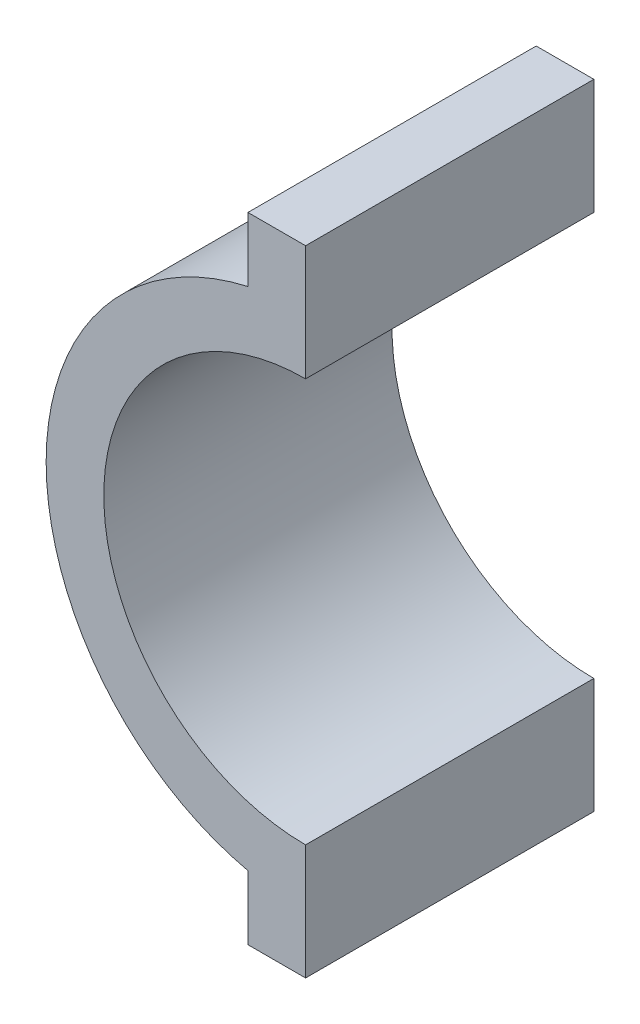
ISO-10303-21;
HEADER;
FILE_DESCRIPTION(('STEP AP214'),'2;1');
FILE_NAME('part.step','',(''),(''),'','','');
FILE_SCHEMA(('AUTOMOTIVE_DESIGN { 1 0 10303 214 1 1 1 1 }'));
ENDSEC;
DATA;
#1=APPLICATION_CONTEXT('core data for automotive mechanical design processes');
#2=APPLICATION_PROTOCOL_DEFINITION('international standard','automotive_design',2000,#1);
#3=PRODUCT_CONTEXT('',#1,'mechanical');
#4=PRODUCT('Part','Part','',(#3));
#5=PRODUCT_RELATED_PRODUCT_CATEGORY('part','',(#4));
#6=PRODUCT_DEFINITION_FORMATION('','',#4);
#7=PRODUCT_DEFINITION_CONTEXT('part definition',#1,'design');
#8=PRODUCT_DEFINITION('design','',#6,#7);
#9=PRODUCT_DEFINITION_SHAPE('','',#8);
#10=(LENGTH_UNIT() NAMED_UNIT(*) SI_UNIT(.MILLI.,.METRE.));
#11=(NAMED_UNIT(*) PLANE_ANGLE_UNIT() SI_UNIT($,.RADIAN.));
#12=(NAMED_UNIT(*) SI_UNIT($,.STERADIAN.) SOLID_ANGLE_UNIT());
#13=UNCERTAINTY_MEASURE_WITH_UNIT(LENGTH_MEASURE(1.E-05),#10,'distance_accuracy_value','');
#14=(GEOMETRIC_REPRESENTATION_CONTEXT(3) GLOBAL_UNCERTAINTY_ASSIGNED_CONTEXT((#13)) GLOBAL_UNIT_ASSIGNED_CONTEXT((#10,
#11,#12)) REPRESENTATION_CONTEXT('',''));
#15=CARTESIAN_POINT('',(0.,0.,0.));
#16=DIRECTION('',(0.,0.,1.));
#17=DIRECTION('',(1.,0.,0.));
#18=AXIS2_PLACEMENT_3D('',#15,#16,#17);
#19=CARTESIAN_POINT('',(0.,0.,25.));
#20=DIRECTION('',(0.,0.,-1.));
#21=DIRECTION('',(-1.,0.,0.));
#22=AXIS2_PLACEMENT_3D('',#19,#20,#21);
#23=CYLINDRICAL_SURFACE('',#22,22.5);
#24=CARTESIAN_POINT('',(0.,0.,0.));
#25=DIRECTION('',(0.,0.,1.));
#26=DIRECTION('',(1.,0.,0.));
#27=AXIS2_PLACEMENT_3D('',#24,#25,#26);
#28=CIRCLE('',#27,22.5);
#29=CARTESIAN_POINT('',(-5.,21.9374109684803,0.));
#30=VERTEX_POINT('',#29);
#31=CARTESIAN_POINT('',(-5.,-21.9374109684803,0.));
#32=VERTEX_POINT('',#31);
#33=EDGE_CURVE('E140',#30,#32,#28,.T.);
#34=ORIENTED_EDGE('',*,*,#33,.T.);
#35=DIRECTION('',(0.,0.,-1.));
#36=VECTOR('',#35,1.);
#37=CARTESIAN_POINT('',(-5.,-21.9374109684803,25.));
#38=LINE('',#37,#36);
#39=CARTESIAN_POINT('',(-5.,-21.9374109684803,25.));
#40=VERTEX_POINT('',#39);
#41=EDGE_CURVE('E11',#40,#32,#38,.T.);
#42=ORIENTED_EDGE('',*,*,#41,.F.);
#43=CARTESIAN_POINT('',(0.,0.,25.));
#44=DIRECTION('',(0.,0.,1.));
#45=DIRECTION('',(1.,0.,0.));
#46=AXIS2_PLACEMENT_3D('',#43,#44,#45);
#47=CIRCLE('',#46,22.5);
#48=CARTESIAN_POINT('',(-5.,21.9374109684803,25.));
#49=VERTEX_POINT('',#48);
#50=EDGE_CURVE('E165',#49,#40,#47,.T.);
#51=ORIENTED_EDGE('',*,*,#50,.F.);
#52=DIRECTION('',(0.,0.,-1.));
#53=VECTOR('',#52,1.);
#54=CARTESIAN_POINT('',(-5.,21.9374109684803,25.));
#55=LINE('',#54,#53);
#56=EDGE_CURVE('E136',#49,#30,#55,.T.);
#57=ORIENTED_EDGE('',*,*,#56,.T.);
#58=EDGE_LOOP('',(#34,#42,#51,#57));
#59=FACE_BOUND('',#58,.T.);
#60=ADVANCED_FACE('F39',(#59),#23,.T.);
#61=CARTESIAN_POINT('',(-5.,-22.5,25.));
#62=DIRECTION('',(1.,0.,0.));
#63=DIRECTION('',(0.,0.,-1.));
#64=AXIS2_PLACEMENT_3D('',#61,#62,#63);
#65=PLANE('',#64);
#66=DIRECTION('',(0.,-1.,0.));
#67=VECTOR('',#66,1.);
#68=CARTESIAN_POINT('',(-5.,-22.5,0.));
#69=LINE('',#68,#67);
#70=CARTESIAN_POINT('',(-5.,-27.5,0.));
#71=VERTEX_POINT('',#70);
#72=EDGE_CURVE('E144',#32,#71,#69,.T.);
#73=ORIENTED_EDGE('',*,*,#72,.T.);
#74=DIRECTION('',(0.,0.,-1.));
#75=VECTOR('',#74,1.);
#76=CARTESIAN_POINT('',(-5.,-27.5,25.));
#77=LINE('',#76,#75);
#78=CARTESIAN_POINT('',(-5.,-27.5,25.));
#79=VERTEX_POINT('',#78);
#80=EDGE_CURVE('E48',#79,#71,#77,.T.);
#81=ORIENTED_EDGE('',*,*,#80,.F.);
#82=DIRECTION('',(0.,-1.,0.));
#83=VECTOR('',#82,1.);
#84=CARTESIAN_POINT('',(-5.,-21.9374109684803,25.));
#85=LINE('',#84,#83);
#86=EDGE_CURVE('E97',#40,#79,#85,.T.);
#87=ORIENTED_EDGE('',*,*,#86,.F.);
#88=ORIENTED_EDGE('',*,*,#41,.T.);
#89=EDGE_LOOP('',(#73,#81,#87,#88));
#90=FACE_BOUND('',#89,.T.);
#91=ADVANCED_FACE('F208',(#90),#65,.F.);
#92=CARTESIAN_POINT('',(-5.,-27.5,25.));
#93=DIRECTION('',(0.,1.,0.));
#94=DIRECTION('',(0.,0.,1.));
#95=AXIS2_PLACEMENT_3D('',#92,#93,#94);
#96=PLANE('',#95);
#97=DIRECTION('',(1.,0.,0.));
#98=VECTOR('',#97,1.);
#99=CARTESIAN_POINT('',(-5.,-27.5,0.));
#100=LINE('',#99,#98);
#101=CARTESIAN_POINT('',(0.,-27.5,0.));
#102=VERTEX_POINT('',#101);
#103=EDGE_CURVE('E147',#71,#102,#100,.T.);
#104=ORIENTED_EDGE('',*,*,#103,.T.);
#105=DIRECTION('',(0.,0.,-1.));
#106=VECTOR('',#105,1.);
#107=CARTESIAN_POINT('',(0.,-27.5,25.));
#108=LINE('',#107,#106);
#109=CARTESIAN_POINT('',(0.,-27.5,25.));
#110=VERTEX_POINT('',#109);
#111=EDGE_CURVE('E176',#110,#102,#108,.T.);
#112=ORIENTED_EDGE('',*,*,#111,.F.);
#113=DIRECTION('',(1.,0.,0.));
#114=VECTOR('',#113,1.);
#115=CARTESIAN_POINT('',(-5.,-27.5,25.));
#116=LINE('',#115,#114);
#117=EDGE_CURVE('E186',#79,#110,#116,.T.);
#118=ORIENTED_EDGE('',*,*,#117,.F.);
#119=ORIENTED_EDGE('',*,*,#80,.T.);
#120=EDGE_LOOP('',(#104,#112,#118,#119));
#121=FACE_BOUND('',#120,.T.);
#122=ADVANCED_FACE('F184',(#121),#96,.F.);
#123=CARTESIAN_POINT('',(0.,-17.5,25.));
#124=DIRECTION('',(-1.,0.,0.));
#125=DIRECTION('',(0.,0.,1.));
#126=AXIS2_PLACEMENT_3D('',#123,#124,#125);
#127=PLANE('',#126);
#128=DIRECTION('',(0.,1.,0.));
#129=VECTOR('',#128,1.);
#130=CARTESIAN_POINT('',(0.,-17.5,0.));
#131=LINE('',#130,#129);
#132=CARTESIAN_POINT('',(0.,-17.5,0.));
#133=VERTEX_POINT('',#132);
#134=EDGE_CURVE('E151',#102,#133,#131,.T.);
#135=ORIENTED_EDGE('',*,*,#134,.T.);
#136=DIRECTION('',(0.,0.,-1.));
#137=VECTOR('',#136,1.);
#138=CARTESIAN_POINT('',(0.,-17.5,25.));
#139=LINE('',#138,#137);
#140=CARTESIAN_POINT('',(0.,-17.5,25.));
#141=VERTEX_POINT('',#140);
#142=EDGE_CURVE('E172',#141,#133,#139,.T.);
#143=ORIENTED_EDGE('',*,*,#142,.F.);
#144=DIRECTION('',(0.,1.,0.));
#145=VECTOR('',#144,1.);
#146=CARTESIAN_POINT('',(0.,-22.5,25.));
#147=LINE('',#146,#145);
#148=EDGE_CURVE('E196',#110,#141,#147,.T.);
#149=ORIENTED_EDGE('',*,*,#148,.F.);
#150=ORIENTED_EDGE('',*,*,#111,.T.);
#151=EDGE_LOOP('',(#135,#143,#149,#150));
#152=FACE_BOUND('',#151,.T.);
#153=ADVANCED_FACE('F191',(#152),#127,.F.);
#154=CARTESIAN_POINT('',(0.,0.,25.));
#155=DIRECTION('',(0.,0.,-1.));
#156=DIRECTION('',(-1.,0.,0.));
#157=AXIS2_PLACEMENT_3D('',#154,#155,#156);
#158=CYLINDRICAL_SURFACE('',#157,17.5);
#159=CARTESIAN_POINT('',(0.,0.,0.));
#160=DIRECTION('',(0.,0.,-1.));
#161=DIRECTION('',(1.,0.,0.));
#162=AXIS2_PLACEMENT_3D('',#159,#160,#161);
#163=CIRCLE('',#162,17.5);
#164=CARTESIAN_POINT('',(0.,17.5,0.));
#165=VERTEX_POINT('',#164);
#166=EDGE_CURVE('E154',#133,#165,#163,.T.);
#167=ORIENTED_EDGE('',*,*,#166,.T.);
#168=DIRECTION('',(0.,0.,-1.));
#169=VECTOR('',#168,1.);
#170=CARTESIAN_POINT('',(0.,17.5,25.));
#171=LINE('',#170,#169);
#172=CARTESIAN_POINT('',(0.,17.5,25.));
#173=VERTEX_POINT('',#172);
#174=EDGE_CURVE('E129',#173,#165,#171,.T.);
#175=ORIENTED_EDGE('',*,*,#174,.F.);
#176=CARTESIAN_POINT('',(0.,0.,25.));
#177=DIRECTION('',(0.,0.,-1.));
#178=DIRECTION('',(1.,0.,0.));
#179=AXIS2_PLACEMENT_3D('',#176,#177,#178);
#180=CIRCLE('',#179,17.5);
#181=EDGE_CURVE('E117',#141,#173,#180,.T.);
#182=ORIENTED_EDGE('',*,*,#181,.F.);
#183=ORIENTED_EDGE('',*,*,#142,.T.);
#184=EDGE_LOOP('',(#167,#175,#182,#183));
#185=FACE_BOUND('',#184,.T.);
#186=ADVANCED_FACE('F194',(#185),#158,.F.);
#187=CARTESIAN_POINT('',(0.,22.5,25.));
#188=DIRECTION('',(-1.,0.,0.));
#189=DIRECTION('',(0.,0.,1.));
#190=AXIS2_PLACEMENT_3D('',#187,#188,#189);
#191=PLANE('',#190);
#192=DIRECTION('',(0.,1.,0.));
#193=VECTOR('',#192,1.);
#194=CARTESIAN_POINT('',(0.,22.5,0.));
#195=LINE('',#194,#193);
#196=CARTESIAN_POINT('',(0.,27.5,0.));
#197=VERTEX_POINT('',#196);
#198=EDGE_CURVE('E126',#165,#197,#195,.T.);
#199=ORIENTED_EDGE('',*,*,#198,.T.);
#200=DIRECTION('',(0.,0.,-1.));
#201=VECTOR('',#200,1.);
#202=CARTESIAN_POINT('',(0.,27.5,25.));
#203=LINE('',#202,#201);
#204=CARTESIAN_POINT('',(0.,27.5,25.));
#205=VERTEX_POINT('',#204);
#206=EDGE_CURVE('E124',#205,#197,#203,.T.);
#207=ORIENTED_EDGE('',*,*,#206,.F.);
#208=DIRECTION('',(0.,1.,0.));
#209=VECTOR('',#208,1.);
#210=CARTESIAN_POINT('',(0.,22.5,25.));
#211=LINE('',#210,#209);
#212=EDGE_CURVE('E110',#173,#205,#211,.T.);
#213=ORIENTED_EDGE('',*,*,#212,.F.);
#214=ORIENTED_EDGE('',*,*,#174,.T.);
#215=EDGE_LOOP('',(#199,#207,#213,#214));
#216=FACE_BOUND('',#215,.T.);
#217=ADVANCED_FACE('F125',(#216),#191,.F.);
#218=CARTESIAN_POINT('',(-5.,27.5,25.));
#219=DIRECTION('',(0.,-1.,0.));
#220=DIRECTION('',(0.,0.,-1.));
#221=AXIS2_PLACEMENT_3D('',#218,#219,#220);
#222=PLANE('',#221);
#223=DIRECTION('',(-1.,0.,0.));
#224=VECTOR('',#223,1.);
#225=CARTESIAN_POINT('',(-5.,27.5,0.));
#226=LINE('',#225,#224);
#227=CARTESIAN_POINT('',(-5.,27.5,0.));
#228=VERTEX_POINT('',#227);
#229=EDGE_CURVE('E160',#197,#228,#226,.T.);
#230=ORIENTED_EDGE('',*,*,#229,.T.);
#231=DIRECTION('',(0.,0.,-1.));
#232=VECTOR('',#231,1.);
#233=CARTESIAN_POINT('',(-5.,27.5,25.));
#234=LINE('',#233,#232);
#235=CARTESIAN_POINT('',(-5.,27.5,25.));
#236=VERTEX_POINT('',#235);
#237=EDGE_CURVE('E130',#236,#228,#234,.T.);
#238=ORIENTED_EDGE('',*,*,#237,.F.);
#239=DIRECTION('',(-1.,0.,0.));
#240=VECTOR('',#239,1.);
#241=CARTESIAN_POINT('',(-5.,27.5,25.));
#242=LINE('',#241,#240);
#243=EDGE_CURVE('E114',#205,#236,#242,.T.);
#244=ORIENTED_EDGE('',*,*,#243,.F.);
#245=ORIENTED_EDGE('',*,*,#206,.T.);
#246=EDGE_LOOP('',(#230,#238,#244,#245));
#247=FACE_BOUND('',#246,.T.);
#248=ADVANCED_FACE('F132',(#247),#222,.F.);
#249=CARTESIAN_POINT('',(-5.,22.5,25.));
#250=DIRECTION('',(1.,0.,0.));
#251=DIRECTION('',(0.,0.,-1.));
#252=AXIS2_PLACEMENT_3D('',#249,#250,#251);
#253=PLANE('',#252);
#254=DIRECTION('',(0.,-1.,0.));
#255=VECTOR('',#254,1.);
#256=CARTESIAN_POINT('',(-5.,22.5,0.));
#257=LINE('',#256,#255);
#258=EDGE_CURVE('E85',#228,#30,#257,.T.);
#259=ORIENTED_EDGE('',*,*,#258,.T.);
#260=ORIENTED_EDGE('',*,*,#56,.F.);
#261=DIRECTION('',(0.,-1.,0.));
#262=VECTOR('',#261,1.);
#263=CARTESIAN_POINT('',(-5.,22.5,25.));
#264=LINE('',#263,#262);
#265=EDGE_CURVE('E56',#236,#49,#264,.T.);
#266=ORIENTED_EDGE('',*,*,#265,.F.);
#267=ORIENTED_EDGE('',*,*,#237,.T.);
#268=EDGE_LOOP('',(#259,#260,#266,#267));
#269=FACE_BOUND('',#268,.T.);
#270=ADVANCED_FACE('F224',(#269),#253,.F.);
#271=CARTESIAN_POINT('',(0.,0.,25.));
#272=DIRECTION('',(0.,0.,1.));
#273=DIRECTION('',(1.,0.,0.));
#274=AXIS2_PLACEMENT_3D('',#271,#272,#273);
#275=PLANE('',#274);
#276=ORIENTED_EDGE('',*,*,#50,.T.);
#277=ORIENTED_EDGE('',*,*,#86,.T.);
#278=ORIENTED_EDGE('',*,*,#117,.T.);
#279=ORIENTED_EDGE('',*,*,#148,.T.);
#280=ORIENTED_EDGE('',*,*,#181,.T.);
#281=ORIENTED_EDGE('',*,*,#212,.T.);
#282=ORIENTED_EDGE('',*,*,#243,.T.);
#283=ORIENTED_EDGE('',*,*,#265,.T.);
#284=EDGE_LOOP('',(#276,#277,#278,#279,#280,#281,#282,#283));
#285=FACE_BOUND('',#284,.T.);
#286=ADVANCED_FACE('F112',(#285),#275,.T.);
#287=CARTESIAN_POINT('',(0.,0.,0.));
#288=DIRECTION('',(0.,0.,1.));
#289=DIRECTION('',(1.,0.,0.));
#290=AXIS2_PLACEMENT_3D('',#287,#288,#289);
#291=PLANE('',#290);
#292=ORIENTED_EDGE('',*,*,#33,.F.);
#293=ORIENTED_EDGE('',*,*,#258,.F.);
#294=ORIENTED_EDGE('',*,*,#229,.F.);
#295=ORIENTED_EDGE('',*,*,#198,.F.);
#296=ORIENTED_EDGE('',*,*,#166,.F.);
#297=ORIENTED_EDGE('',*,*,#134,.F.);
#298=ORIENTED_EDGE('',*,*,#103,.F.);
#299=ORIENTED_EDGE('',*,*,#72,.F.);
#300=EDGE_LOOP('',(#292,#293,#294,#295,#296,#297,#298,#299));
#301=FACE_BOUND('',#300,.T.);
#302=ADVANCED_FACE('F187',(#301),#291,.F.);
#303=CLOSED_SHELL('',(#60,#91,#122,#153,#186,#217,#248,#270,#286,#302));
#304=MANIFOLD_SOLID_BREP('B2',#303);
#305=ADVANCED_BREP_SHAPE_REPRESENTATION('',(#18,#304),#14);
#306=SHAPE_DEFINITION_REPRESENTATION(#9,#305);
ENDSEC;
END-ISO-10303-21;
